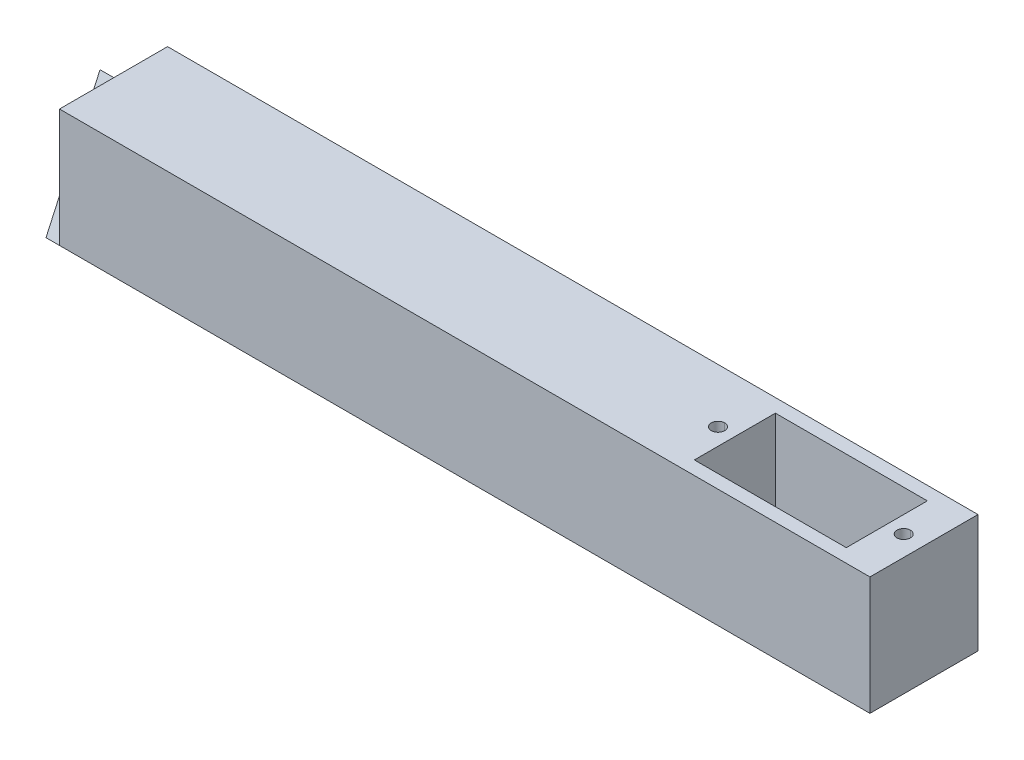
ISO-10303-21;
HEADER;
FILE_DESCRIPTION(('STEP AP214'),'2;1');
FILE_NAME('part.step','',(''),(''),'','','');
FILE_SCHEMA(('AUTOMOTIVE_DESIGN { 1 0 10303 214 1 1 1 1 }'));
ENDSEC;
DATA;
#1=APPLICATION_CONTEXT('core data for automotive mechanical design processes');
#2=APPLICATION_PROTOCOL_DEFINITION('international standard','automotive_design',2000,#1);
#3=PRODUCT_CONTEXT('',#1,'mechanical');
#4=PRODUCT('Part','Part','',(#3));
#5=PRODUCT_RELATED_PRODUCT_CATEGORY('part','',(#4));
#6=PRODUCT_DEFINITION_FORMATION('','',#4);
#7=PRODUCT_DEFINITION_CONTEXT('part definition',#1,'design');
#8=PRODUCT_DEFINITION('design','',#6,#7);
#9=PRODUCT_DEFINITION_SHAPE('','',#8);
#10=(LENGTH_UNIT() NAMED_UNIT(*) SI_UNIT(.MILLI.,.METRE.));
#11=(NAMED_UNIT(*) PLANE_ANGLE_UNIT() SI_UNIT($,.RADIAN.));
#12=(NAMED_UNIT(*) SI_UNIT($,.STERADIAN.) SOLID_ANGLE_UNIT());
#13=UNCERTAINTY_MEASURE_WITH_UNIT(LENGTH_MEASURE(1.E-05),#10,'distance_accuracy_value','');
#14=(GEOMETRIC_REPRESENTATION_CONTEXT(3) GLOBAL_UNCERTAINTY_ASSIGNED_CONTEXT((#13)) GLOBAL_UNIT_ASSIGNED_CONTEXT((#10,
#11,#12)) REPRESENTATION_CONTEXT('',''));
#15=CARTESIAN_POINT('',(0.,0.,0.));
#16=DIRECTION('',(0.,0.,1.));
#17=DIRECTION('',(1.,0.,0.));
#18=AXIS2_PLACEMENT_3D('',#15,#16,#17);
#19=CARTESIAN_POINT('',(-67.9317104586346,5.08780090483286,0.049999999999863));
#20=DIRECTION('',(-1.,0.,0.));
#21=DIRECTION('',(0.,0.,1.));
#22=AXIS2_PLACEMENT_3D('',#19,#20,#21);
#23=PLANE('',#22);
#24=CARTESIAN_POINT('',(-67.9317104586346,5.08780090483286,0.049999999999863));
#25=DIRECTION('',(-1.,0.,0.));
#26=DIRECTION('',(0.,0.,1.));
#27=AXIS2_PLACEMENT_3D('',#24,#25,#26);
#28=CIRCLE('',#27,1.);
#29=CARTESIAN_POINT('',(-67.9317104586346,5.08780090483286,1.04999999999986));
#30=VERTEX_POINT('',#29);
#31=CARTESIAN_POINT('',(-67.9317104586346,5.08780090483286,-0.950000000000137));
#32=VERTEX_POINT('',#31);
#33=EDGE_CURVE('E9',#30,#32,#28,.T.);
#34=ORIENTED_EDGE('',*,*,#33,.T.);
#35=CARTESIAN_POINT('',(-67.9317104586346,5.08780090483286,0.049999999999863));
#36=DIRECTION('',(-1.,0.,0.));
#37=DIRECTION('',(0.,0.,1.));
#38=AXIS2_PLACEMENT_3D('',#35,#36,#37);
#39=CIRCLE('',#38,1.);
#40=EDGE_CURVE('E175',#32,#30,#39,.T.);
#41=ORIENTED_EDGE('',*,*,#40,.T.);
#42=EDGE_LOOP('',(#34,#41));
#43=FACE_BOUND('',#42,.T.);
#44=ADVANCED_FACE('F14',(#43),#23,.T.);
#45=CARTESIAN_POINT('',(-67.9317104586346,5.08780090483286,0.049999999999863));
#46=DIRECTION('',(-1.,0.,0.));
#47=DIRECTION('',(0.,0.,1.));
#48=AXIS2_PLACEMENT_3D('',#45,#46,#47);
#49=CYLINDRICAL_SURFACE('',#48,1.);
#50=DIRECTION('',(-1.,0.,0.));
#51=VECTOR('',#50,1.);
#52=CARTESIAN_POINT('',(-67.9317104586346,5.08780090483286,-0.950000000000137));
#53=LINE('',#52,#51);
#54=CARTESIAN_POINT('',(-81.9317104586346,5.08780090483286,-0.950000000000137));
#55=VERTEX_POINT('',#54);
#56=EDGE_CURVE('E180',#32,#55,#53,.T.);
#57=ORIENTED_EDGE('',*,*,#56,.F.);
#58=ORIENTED_EDGE('',*,*,#33,.F.);
#59=DIRECTION('',(-1.,0.,0.));
#60=VECTOR('',#59,1.);
#61=CARTESIAN_POINT('',(-67.9317104586346,5.08780090483286,1.04999999999986));
#62=LINE('',#61,#60);
#63=CARTESIAN_POINT('',(-81.9317104586346,5.08780090483286,1.04999999999986));
#64=VERTEX_POINT('',#63);
#65=EDGE_CURVE('E189',#30,#64,#62,.T.);
#66=ORIENTED_EDGE('',*,*,#65,.T.);
#67=CARTESIAN_POINT('',(-81.9317104586346,5.08780090483286,0.049999999999863));
#68=DIRECTION('',(-1.,0.,0.));
#69=DIRECTION('',(0.,0.,1.));
#70=AXIS2_PLACEMENT_3D('',#67,#68,#69);
#71=CIRCLE('',#70,1.);
#72=EDGE_CURVE('E22',#64,#55,#71,.T.);
#73=ORIENTED_EDGE('',*,*,#72,.T.);
#74=EDGE_LOOP('',(#57,#58,#66,#73));
#75=FACE_BOUND('',#74,.T.);
#76=ADVANCED_FACE('F181',(#75),#49,.F.);
#77=CARTESIAN_POINT('',(37.0682895413656,0.,-5.21804821573824E-12));
#78=DIRECTION('',(0.,1.,0.));
#79=DIRECTION('',(0.,0.,1.));
#80=AXIS2_PLACEMENT_3D('',#77,#78,#79);
#81=CYLINDRICAL_SURFACE('',#80,0.999999999998254);
#82=DIRECTION('',(0.,1.,0.));
#83=VECTOR('',#82,1.);
#84=CARTESIAN_POINT('',(37.0682895413656,0.,-1.00000000000347));
#85=LINE('',#84,#83);
#86=CARTESIAN_POINT('',(37.0682895413656,0.,-1.00000000000347));
#87=VERTEX_POINT('',#86);
#88=CARTESIAN_POINT('',(37.0682895413656,17.5,-1.00000000000347));
#89=VERTEX_POINT('',#88);
#90=EDGE_CURVE('E224',#87,#89,#85,.T.);
#91=ORIENTED_EDGE('',*,*,#90,.F.);
#92=CARTESIAN_POINT('',(37.0682895413656,0.,-5.21804821573824E-12));
#93=DIRECTION('',(0.,1.,0.));
#94=DIRECTION('',(0.,0.,1.));
#95=AXIS2_PLACEMENT_3D('',#92,#93,#94);
#96=CIRCLE('',#95,0.999999999998254);
#97=CARTESIAN_POINT('',(37.0682895413656,0.,0.999999999993036));
#98=VERTEX_POINT('',#97);
#99=EDGE_CURVE('E331',#98,#87,#96,.T.);
#100=ORIENTED_EDGE('',*,*,#99,.F.);
#101=DIRECTION('',(0.,1.,0.));
#102=VECTOR('',#101,1.);
#103=CARTESIAN_POINT('',(37.0682895413656,0.,0.999999999993036));
#104=LINE('',#103,#102);
#105=CARTESIAN_POINT('',(37.0682895413656,17.5,0.999999999993036));
#106=VERTEX_POINT('',#105);
#107=EDGE_CURVE('E197',#98,#106,#104,.T.);
#108=ORIENTED_EDGE('',*,*,#107,.T.);
#109=CARTESIAN_POINT('',(37.0682895413656,17.5,-5.21804821573824E-12));
#110=DIRECTION('',(0.,1.,0.));
#111=DIRECTION('',(0.,0.,1.));
#112=AXIS2_PLACEMENT_3D('',#109,#110,#111);
#113=CIRCLE('',#112,0.999999999998254);
#114=EDGE_CURVE('E296',#106,#89,#113,.T.);
#115=ORIENTED_EDGE('',*,*,#114,.T.);
#116=EDGE_LOOP('',(#91,#100,#108,#115));
#117=FACE_BOUND('',#116,.T.);
#118=ADVANCED_FACE('F421',(#117),#81,.F.);
#119=CARTESIAN_POINT('',(9.56828954136565,0.,-5.21804821573824E-12));
#120=DIRECTION('',(0.,1.,0.));
#121=DIRECTION('',(0.,0.,1.));
#122=AXIS2_PLACEMENT_3D('',#119,#120,#121);
#123=CYLINDRICAL_SURFACE('',#122,0.999999999998255);
#124=DIRECTION('',(0.,1.,0.));
#125=VECTOR('',#124,1.);
#126=CARTESIAN_POINT('',(9.56828954136565,0.,-1.00000000000347));
#127=LINE('',#126,#125);
#128=CARTESIAN_POINT('',(9.56828954136565,0.,-1.00000000000347));
#129=VERTEX_POINT('',#128);
#130=CARTESIAN_POINT('',(9.56828954136565,17.5,-1.00000000000347));
#131=VERTEX_POINT('',#130);
#132=EDGE_CURVE('E238',#129,#131,#127,.T.);
#133=ORIENTED_EDGE('',*,*,#132,.F.);
#134=CARTESIAN_POINT('',(9.56828954136565,0.,-5.21804821573824E-12));
#135=DIRECTION('',(0.,1.,0.));
#136=DIRECTION('',(0.,0.,1.));
#137=AXIS2_PLACEMENT_3D('',#134,#135,#136);
#138=CIRCLE('',#137,0.999999999998255);
#139=CARTESIAN_POINT('',(9.56828954136565,0.,0.999999999993037));
#140=VERTEX_POINT('',#139);
#141=EDGE_CURVE('E334',#140,#129,#138,.T.);
#142=ORIENTED_EDGE('',*,*,#141,.F.);
#143=DIRECTION('',(0.,1.,0.));
#144=VECTOR('',#143,1.);
#145=CARTESIAN_POINT('',(9.56828954136565,0.,0.999999999993037));
#146=LINE('',#145,#144);
#147=CARTESIAN_POINT('',(9.56828954136565,17.5,0.999999999993037));
#148=VERTEX_POINT('',#147);
#149=EDGE_CURVE('E198',#140,#148,#146,.T.);
#150=ORIENTED_EDGE('',*,*,#149,.T.);
#151=CARTESIAN_POINT('',(9.56828954136565,17.5,-5.21804821573824E-12));
#152=DIRECTION('',(0.,1.,0.));
#153=DIRECTION('',(0.,0.,1.));
#154=AXIS2_PLACEMENT_3D('',#151,#152,#153);
#155=CIRCLE('',#154,0.999999999998255);
#156=EDGE_CURVE('E299',#148,#131,#155,.T.);
#157=ORIENTED_EDGE('',*,*,#156,.T.);
#158=EDGE_LOOP('',(#133,#142,#150,#157));
#159=FACE_BOUND('',#158,.T.);
#160=ADVANCED_FACE('F425',(#159),#123,.F.);
#161=CARTESIAN_POINT('',(-81.9317104586346,0.,0.));
#162=DIRECTION('',(1.,0.,0.));
#163=DIRECTION('',(0.,1.,0.));
#164=AXIS2_PLACEMENT_3D('',#161,#162,#163);
#165=PLANE('',#164);
#166=ORIENTED_EDGE('',*,*,#72,.F.);
#167=CARTESIAN_POINT('',(-81.9317104586346,5.08780090483286,0.049999999999863));
#168=DIRECTION('',(-1.,0.,0.));
#169=DIRECTION('',(0.,0.,1.));
#170=AXIS2_PLACEMENT_3D('',#167,#168,#169);
#171=CIRCLE('',#170,1.);
#172=EDGE_CURVE('E186',#55,#64,#171,.T.);
#173=ORIENTED_EDGE('',*,*,#172,.F.);
#174=EDGE_LOOP('',(#166,#173));
#175=FACE_BOUND('',#174,.T.);
#176=DIRECTION('',(0.,0.9098434748613,-0.414951625195415));
#177=VECTOR('',#176,1.);
#178=CARTESIAN_POINT('',(-81.9317104586346,0.,8.));
#179=LINE('',#178,#177);
#180=CARTESIAN_POINT('',(-81.9317104586346,0.,8.));
#181=VERTEX_POINT('',#180);
#182=CARTESIAN_POINT('',(-81.9317104586346,17.5411960260731,0.));
#183=VERTEX_POINT('',#182);
#184=EDGE_CURVE('E271',#181,#183,#179,.T.);
#185=ORIENTED_EDGE('',*,*,#184,.T.);
#186=DIRECTION('',(0.,-0.9098434748613,-0.414951625195415));
#187=VECTOR('',#186,1.);
#188=CARTESIAN_POINT('',(-81.9317104586346,17.5411960260731,0.));
#189=LINE('',#188,#187);
#190=CARTESIAN_POINT('',(-81.9317104586346,0.,-8.));
#191=VERTEX_POINT('',#190);
#192=EDGE_CURVE('E35',#183,#191,#189,.T.);
#193=ORIENTED_EDGE('',*,*,#192,.T.);
#194=DIRECTION('',(0.,0.,1.));
#195=VECTOR('',#194,1.);
#196=CARTESIAN_POINT('',(-81.9317104586346,0.,-8.));
#197=LINE('',#196,#195);
#198=EDGE_CURVE('E318',#191,#181,#197,.T.);
#199=ORIENTED_EDGE('',*,*,#198,.T.);
#200=EDGE_LOOP('',(#185,#193,#199));
#201=FACE_BOUND('',#200,.T.);
#202=ADVANCED_FACE('F392',(#175,#201),#165,.F.);
#203=CARTESIAN_POINT('',(-81.9317104586346,17.5411960260731,0.));
#204=DIRECTION('',(0.,-0.414951625195415,0.9098434748613));
#205=DIRECTION('',(-1.,0.,0.));
#206=AXIS2_PLACEMENT_3D('',#203,#204,#205);
#207=PLANE('',#206);
#208=DIRECTION('',(0.,-0.9098434748613,-0.414951625195415));
#209=VECTOR('',#208,1.);
#210=CARTESIAN_POINT('',(-79.9317104586346,17.5411960260731,0.));
#211=LINE('',#210,#209);
#212=CARTESIAN_POINT('',(-79.9317104586346,17.5411960260731,0.));
#213=VERTEX_POINT('',#212);
#214=CARTESIAN_POINT('',(-79.9317104586346,17.5,-0.0187882404424052));
#215=VERTEX_POINT('',#214);
#216=EDGE_CURVE('E207',#213,#215,#211,.T.);
#217=ORIENTED_EDGE('',*,*,#216,.T.);
#218=DIRECTION('',(0.,-0.9098434748613,-0.414951625195415));
#219=VECTOR('',#218,1.);
#220=CARTESIAN_POINT('',(-79.9317104586346,17.5411960260731,0.));
#221=LINE('',#220,#219);
#222=CARTESIAN_POINT('',(-79.9317104586346,0.,-8.));
#223=VERTEX_POINT('',#222);
#224=EDGE_CURVE('E218',#215,#223,#221,.T.);
#225=ORIENTED_EDGE('',*,*,#224,.T.);
#226=DIRECTION('',(1.,0.,0.));
#227=VECTOR('',#226,1.);
#228=CARTESIAN_POINT('',(-81.9317104586346,0.,-8.));
#229=LINE('',#228,#227);
#230=EDGE_CURVE('E322',#191,#223,#229,.T.);
#231=ORIENTED_EDGE('',*,*,#230,.F.);
#232=ORIENTED_EDGE('',*,*,#192,.F.);
#233=DIRECTION('',(1.,0.,0.));
#234=VECTOR('',#233,1.);
#235=CARTESIAN_POINT('',(-81.9317104586346,17.5411960260731,0.));
#236=LINE('',#235,#234);
#237=EDGE_CURVE('E43',#183,#213,#236,.T.);
#238=ORIENTED_EDGE('',*,*,#237,.T.);
#239=EDGE_LOOP('',(#217,#225,#231,#232,#238));
#240=FACE_BOUND('',#239,.T.);
#241=ADVANCED_FACE('F370',(#240),#207,.F.);
#242=CARTESIAN_POINT('',(-81.9317104586346,0.,8.));
#243=DIRECTION('',(0.,-0.414951625195415,-0.9098434748613));
#244=DIRECTION('',(0.,-0.9098434748613,0.414951625195415));
#245=AXIS2_PLACEMENT_3D('',#242,#243,#244);
#246=PLANE('',#245);
#247=DIRECTION('',(0.,0.9098434748613,-0.414951625195415));
#248=VECTOR('',#247,1.);
#249=CARTESIAN_POINT('',(-79.9317104586346,0.,8.));
#250=LINE('',#249,#248);
#251=CARTESIAN_POINT('',(-79.9317104586346,0.,8.));
#252=VERTEX_POINT('',#251);
#253=CARTESIAN_POINT('',(-79.9317104586346,17.5,0.0187882404424026));
#254=VERTEX_POINT('',#253);
#255=EDGE_CURVE('E201',#252,#254,#250,.T.);
#256=ORIENTED_EDGE('',*,*,#255,.T.);
#257=DIRECTION('',(0.,0.9098434748613,-0.414951625195415));
#258=VECTOR('',#257,1.);
#259=CARTESIAN_POINT('',(-79.9317104586346,0.,8.));
#260=LINE('',#259,#258);
#261=EDGE_CURVE('E204',#254,#213,#260,.T.);
#262=ORIENTED_EDGE('',*,*,#261,.T.);
#263=ORIENTED_EDGE('',*,*,#237,.F.);
#264=ORIENTED_EDGE('',*,*,#184,.F.);
#265=DIRECTION('',(1.,0.,0.));
#266=VECTOR('',#265,1.);
#267=CARTESIAN_POINT('',(-81.9317104586346,0.,8.));
#268=LINE('',#267,#266);
#269=EDGE_CURVE('E315',#181,#252,#268,.T.);
#270=ORIENTED_EDGE('',*,*,#269,.T.);
#271=EDGE_LOOP('',(#256,#262,#263,#264,#270));
#272=FACE_BOUND('',#271,.T.);
#273=ADVANCED_FACE('F394',(#272),#246,.F.);
#274=CARTESIAN_POINT('',(-79.9317104586346,0.,0.));
#275=DIRECTION('',(1.,0.,0.));
#276=DIRECTION('',(0.,1.,0.));
#277=AXIS2_PLACEMENT_3D('',#274,#275,#276);
#278=PLANE('',#277);
#279=DIRECTION('',(0.,0.,1.));
#280=VECTOR('',#279,1.);
#281=CARTESIAN_POINT('',(-79.9317104586346,17.5,8.));
#282=LINE('',#281,#280);
#283=EDGE_CURVE('E288',#215,#254,#282,.T.);
#284=ORIENTED_EDGE('',*,*,#283,.F.);
#285=ORIENTED_EDGE('',*,*,#216,.F.);
#286=ORIENTED_EDGE('',*,*,#261,.F.);
#287=EDGE_LOOP('',(#284,#285,#286));
#288=FACE_BOUND('',#287,.T.);
#289=ADVANCED_FACE('F373',(#288),#278,.T.);
#290=CARTESIAN_POINT('',(12.0682895413654,17.5,6.));
#291=DIRECTION('',(0.,0.,-1.));
#292=DIRECTION('',(0.,-1.,0.));
#293=AXIS2_PLACEMENT_3D('',#290,#291,#292);
#294=PLANE('',#293);
#295=DIRECTION('',(1.,0.,0.));
#296=VECTOR('',#295,1.);
#297=CARTESIAN_POINT('',(12.0682895413654,0.,6.));
#298=LINE('',#297,#296);
#299=CARTESIAN_POINT('',(12.0682895413654,0.,6.));
#300=VERTEX_POINT('',#299);
#301=CARTESIAN_POINT('',(34.5682895413654,0.,6.));
#302=VERTEX_POINT('',#301);
#303=EDGE_CURVE('E337',#300,#302,#298,.T.);
#304=ORIENTED_EDGE('',*,*,#303,.F.);
#305=DIRECTION('',(0.,-1.,0.));
#306=VECTOR('',#305,1.);
#307=CARTESIAN_POINT('',(12.0682895413654,17.5,6.));
#308=LINE('',#307,#306);
#309=CARTESIAN_POINT('',(12.0682895413654,17.5,6.));
#310=VERTEX_POINT('',#309);
#311=EDGE_CURVE('E363',#310,#300,#308,.T.);
#312=ORIENTED_EDGE('',*,*,#311,.F.);
#313=DIRECTION('',(1.,0.,0.));
#314=VECTOR('',#313,1.);
#315=CARTESIAN_POINT('',(12.0682895413654,17.5,6.));
#316=LINE('',#315,#314);
#317=CARTESIAN_POINT('',(34.5682895413654,17.5,6.));
#318=VERTEX_POINT('',#317);
#319=EDGE_CURVE('E208',#310,#318,#316,.T.);
#320=ORIENTED_EDGE('',*,*,#319,.T.);
#321=DIRECTION('',(0.,-1.,0.));
#322=VECTOR('',#321,1.);
#323=CARTESIAN_POINT('',(34.5682895413654,17.5,6.));
#324=LINE('',#323,#322);
#325=EDGE_CURVE('E249',#318,#302,#324,.T.);
#326=ORIENTED_EDGE('',*,*,#325,.T.);
#327=EDGE_LOOP('',(#304,#312,#320,#326));
#328=FACE_BOUND('',#327,.T.);
#329=ADVANCED_FACE('F443',(#328),#294,.T.);
#330=CARTESIAN_POINT('',(12.0682895413654,17.5,6.));
#331=DIRECTION('',(1.,0.,0.));
#332=DIRECTION('',(0.,0.,-1.));
#333=AXIS2_PLACEMENT_3D('',#330,#331,#332);
#334=PLANE('',#333);
#335=DIRECTION('',(0.,0.,1.));
#336=VECTOR('',#335,1.);
#337=CARTESIAN_POINT('',(12.0682895413654,0.,6.));
#338=LINE('',#337,#336);
#339=CARTESIAN_POINT('',(12.0682895413654,0.,-6.));
#340=VERTEX_POINT('',#339);
#341=EDGE_CURVE('E349',#340,#300,#338,.T.);
#342=ORIENTED_EDGE('',*,*,#341,.F.);
#343=DIRECTION('',(0.,-1.,0.));
#344=VECTOR('',#343,1.);
#345=CARTESIAN_POINT('',(12.0682895413654,17.5,-6.));
#346=LINE('',#345,#344);
#347=CARTESIAN_POINT('',(12.0682895413654,17.5,-6.));
#348=VERTEX_POINT('',#347);
#349=EDGE_CURVE('E360',#348,#340,#346,.T.);
#350=ORIENTED_EDGE('',*,*,#349,.F.);
#351=DIRECTION('',(0.,0.,1.));
#352=VECTOR('',#351,1.);
#353=CARTESIAN_POINT('',(12.0682895413654,17.5,6.));
#354=LINE('',#353,#352);
#355=EDGE_CURVE('E212',#348,#310,#354,.T.);
#356=ORIENTED_EDGE('',*,*,#355,.T.);
#357=ORIENTED_EDGE('',*,*,#311,.T.);
#358=EDGE_LOOP('',(#342,#350,#356,#357));
#359=FACE_BOUND('',#358,.T.);
#360=ADVANCED_FACE('F440',(#359),#334,.T.);
#361=CARTESIAN_POINT('',(12.0682895413654,17.5,-6.));
#362=DIRECTION('',(0.,0.,1.));
#363=DIRECTION('',(1.,0.,0.));
#364=AXIS2_PLACEMENT_3D('',#361,#362,#363);
#365=PLANE('',#364);
#366=DIRECTION('',(-1.,0.,0.));
#367=VECTOR('',#366,1.);
#368=CARTESIAN_POINT('',(12.0682895413654,0.,-6.));
#369=LINE('',#368,#367);
#370=CARTESIAN_POINT('',(34.5682895413654,0.,-6.));
#371=VERTEX_POINT('',#370);
#372=EDGE_CURVE('E345',#371,#340,#369,.T.);
#373=ORIENTED_EDGE('',*,*,#372,.F.);
#374=DIRECTION('',(0.,-1.,0.));
#375=VECTOR('',#374,1.);
#376=CARTESIAN_POINT('',(34.5682895413654,17.5,-6.));
#377=LINE('',#376,#375);
#378=CARTESIAN_POINT('',(34.5682895413654,17.5,-6.));
#379=VERTEX_POINT('',#378);
#380=EDGE_CURVE('E357',#379,#371,#377,.T.);
#381=ORIENTED_EDGE('',*,*,#380,.F.);
#382=DIRECTION('',(-1.,0.,0.));
#383=VECTOR('',#382,1.);
#384=CARTESIAN_POINT('',(12.0682895413654,17.5,-6.));
#385=LINE('',#384,#383);
#386=EDGE_CURVE('E229',#379,#348,#385,.T.);
#387=ORIENTED_EDGE('',*,*,#386,.T.);
#388=ORIENTED_EDGE('',*,*,#349,.T.);
#389=EDGE_LOOP('',(#373,#381,#387,#388));
#390=FACE_BOUND('',#389,.T.);
#391=ADVANCED_FACE('F413',(#390),#365,.T.);
#392=CARTESIAN_POINT('',(34.5682895413654,17.5,6.));
#393=DIRECTION('',(-1.,0.,0.));
#394=DIRECTION('',(0.,0.,1.));
#395=AXIS2_PLACEMENT_3D('',#392,#393,#394);
#396=PLANE('',#395);
#397=DIRECTION('',(0.,0.,-1.));
#398=VECTOR('',#397,1.);
#399=CARTESIAN_POINT('',(34.5682895413654,0.,6.));
#400=LINE('',#399,#398);
#401=EDGE_CURVE('E341',#302,#371,#400,.T.);
#402=ORIENTED_EDGE('',*,*,#401,.F.);
#403=ORIENTED_EDGE('',*,*,#325,.F.);
#404=DIRECTION('',(0.,0.,-1.));
#405=VECTOR('',#404,1.);
#406=CARTESIAN_POINT('',(34.5682895413654,17.5,6.));
#407=LINE('',#406,#405);
#408=EDGE_CURVE('E213',#318,#379,#407,.T.);
#409=ORIENTED_EDGE('',*,*,#408,.T.);
#410=ORIENTED_EDGE('',*,*,#380,.T.);
#411=EDGE_LOOP('',(#402,#403,#409,#410));
#412=FACE_BOUND('',#411,.T.);
#413=ADVANCED_FACE('F405',(#412),#396,.T.);
#414=CARTESIAN_POINT('',(-79.9317104586346,17.5,8.));
#415=DIRECTION('',(0.,0.,-1.));
#416=DIRECTION('',(0.,-1.,0.));
#417=AXIS2_PLACEMENT_3D('',#414,#415,#416);
#418=PLANE('',#417);
#419=DIRECTION('',(1.,0.,0.));
#420=VECTOR('',#419,1.);
#421=CARTESIAN_POINT('',(-79.9317104586346,0.,8.));
#422=LINE('',#421,#420);
#423=CARTESIAN_POINT('',(40.0682895413654,0.,8.));
#424=VERTEX_POINT('',#423);
#425=EDGE_CURVE('E311',#252,#424,#422,.T.);
#426=ORIENTED_EDGE('',*,*,#425,.T.);
#427=DIRECTION('',(0.,-1.,0.));
#428=VECTOR('',#427,1.);
#429=CARTESIAN_POINT('',(40.0682895413654,17.5,8.));
#430=LINE('',#429,#428);
#431=CARTESIAN_POINT('',(40.0682895413654,17.5,8.));
#432=VERTEX_POINT('',#431);
#433=EDGE_CURVE('E246',#432,#424,#430,.T.);
#434=ORIENTED_EDGE('',*,*,#433,.F.);
#435=DIRECTION('',(1.,0.,0.));
#436=VECTOR('',#435,1.);
#437=CARTESIAN_POINT('',(-79.9317104586346,17.5,8.));
#438=LINE('',#437,#436);
#439=CARTESIAN_POINT('',(-79.9317104586346,17.5,8.));
#440=VERTEX_POINT('',#439);
#441=EDGE_CURVE('E292',#440,#432,#438,.T.);
#442=ORIENTED_EDGE('',*,*,#441,.F.);
#443=DIRECTION('',(0.,-1.,0.));
#444=VECTOR('',#443,1.);
#445=CARTESIAN_POINT('',(-79.9317104586346,17.5,8.));
#446=LINE('',#445,#444);
#447=EDGE_CURVE('E219',#440,#252,#446,.T.);
#448=ORIENTED_EDGE('',*,*,#447,.T.);
#449=EDGE_LOOP('',(#426,#434,#442,#448));
#450=FACE_BOUND('',#449,.T.);
#451=ADVANCED_FACE('F403',(#450),#418,.F.);
#452=CARTESIAN_POINT('',(-79.9317104586346,17.5,-8.));
#453=DIRECTION('',(0.,0.,1.));
#454=DIRECTION('',(1.,0.,0.));
#455=AXIS2_PLACEMENT_3D('',#452,#453,#454);
#456=PLANE('',#455);
#457=DIRECTION('',(-1.,0.,0.));
#458=VECTOR('',#457,1.);
#459=CARTESIAN_POINT('',(-79.9317104586346,0.,-8.));
#460=LINE('',#459,#458);
#461=CARTESIAN_POINT('',(40.0682895413654,0.,-8.));
#462=VERTEX_POINT('',#461);
#463=EDGE_CURVE('E326',#462,#223,#460,.T.);
#464=ORIENTED_EDGE('',*,*,#463,.T.);
#465=DIRECTION('',(0.,-1.,0.));
#466=VECTOR('',#465,1.);
#467=CARTESIAN_POINT('',(-79.9317104586346,17.5,-8.));
#468=LINE('',#467,#466);
#469=CARTESIAN_POINT('',(-79.9317104586346,17.5,-8.));
#470=VERTEX_POINT('',#469);
#471=EDGE_CURVE('E277',#470,#223,#468,.T.);
#472=ORIENTED_EDGE('',*,*,#471,.F.);
#473=DIRECTION('',(-1.,0.,0.));
#474=VECTOR('',#473,1.);
#475=CARTESIAN_POINT('',(-79.9317104586346,17.5,-8.));
#476=LINE('',#475,#474);
#477=CARTESIAN_POINT('',(40.0682895413654,17.5,-8.));
#478=VERTEX_POINT('',#477);
#479=EDGE_CURVE('E285',#478,#470,#476,.T.);
#480=ORIENTED_EDGE('',*,*,#479,.F.);
#481=DIRECTION('',(0.,-1.,0.));
#482=VECTOR('',#481,1.);
#483=CARTESIAN_POINT('',(40.0682895413654,17.5,-8.));
#484=LINE('',#483,#482);
#485=EDGE_CURVE('E250',#478,#462,#484,.T.);
#486=ORIENTED_EDGE('',*,*,#485,.T.);
#487=EDGE_LOOP('',(#464,#472,#480,#486));
#488=FACE_BOUND('',#487,.T.);
#489=ADVANCED_FACE('F383',(#488),#456,.F.);
#490=CARTESIAN_POINT('',(40.0682895413654,17.5,8.));
#491=DIRECTION('',(-1.,0.,0.));
#492=DIRECTION('',(0.,0.,1.));
#493=AXIS2_PLACEMENT_3D('',#490,#491,#492);
#494=PLANE('',#493);
#495=DIRECTION('',(0.,0.,-1.));
#496=VECTOR('',#495,1.);
#497=CARTESIAN_POINT('',(40.0682895413654,0.,8.));
#498=LINE('',#497,#496);
#499=EDGE_CURVE('E233',#424,#462,#498,.T.);
#500=ORIENTED_EDGE('',*,*,#499,.T.);
#501=ORIENTED_EDGE('',*,*,#485,.F.);
#502=DIRECTION('',(0.,0.,-1.));
#503=VECTOR('',#502,1.);
#504=CARTESIAN_POINT('',(40.0682895413654,17.5,8.));
#505=LINE('',#504,#503);
#506=EDGE_CURVE('E281',#432,#478,#505,.T.);
#507=ORIENTED_EDGE('',*,*,#506,.F.);
#508=ORIENTED_EDGE('',*,*,#433,.T.);
#509=EDGE_LOOP('',(#500,#501,#507,#508));
#510=FACE_BOUND('',#509,.T.);
#511=ADVANCED_FACE('F402',(#510),#494,.F.);
#512=CARTESIAN_POINT('',(0.,0.,0.));
#513=DIRECTION('',(0.,-1.,0.));
#514=DIRECTION('',(0.,0.,-1.));
#515=AXIS2_PLACEMENT_3D('',#512,#513,#514);
#516=PLANE('',#515);
#517=ORIENTED_EDGE('',*,*,#303,.T.);
#518=ORIENTED_EDGE('',*,*,#401,.T.);
#519=ORIENTED_EDGE('',*,*,#372,.T.);
#520=ORIENTED_EDGE('',*,*,#341,.T.);
#521=EDGE_LOOP('',(#517,#518,#519,#520));
#522=FACE_BOUND('',#521,.T.);
#523=ORIENTED_EDGE('',*,*,#141,.T.);
#524=CARTESIAN_POINT('',(9.56828954136565,0.,-5.21804821573824E-12));
#525=DIRECTION('',(0.,1.,0.));
#526=DIRECTION('',(0.,0.,1.));
#527=AXIS2_PLACEMENT_3D('',#524,#525,#526);
#528=CIRCLE('',#527,0.999999999998255);
#529=EDGE_CURVE('E242',#129,#140,#528,.T.);
#530=ORIENTED_EDGE('',*,*,#529,.T.);
#531=EDGE_LOOP('',(#523,#530));
#532=FACE_BOUND('',#531,.T.);
#533=ORIENTED_EDGE('',*,*,#99,.T.);
#534=CARTESIAN_POINT('',(37.0682895413656,0.,-5.21804821573824E-12));
#535=DIRECTION('',(0.,1.,0.));
#536=DIRECTION('',(0.,0.,1.));
#537=AXIS2_PLACEMENT_3D('',#534,#535,#536);
#538=CIRCLE('',#537,0.999999999998254);
#539=EDGE_CURVE('E225',#87,#98,#538,.T.);
#540=ORIENTED_EDGE('',*,*,#539,.T.);
#541=EDGE_LOOP('',(#533,#540));
#542=FACE_BOUND('',#541,.T.);
#543=ORIENTED_EDGE('',*,*,#499,.F.);
#544=ORIENTED_EDGE('',*,*,#425,.F.);
#545=ORIENTED_EDGE('',*,*,#269,.F.);
#546=ORIENTED_EDGE('',*,*,#198,.F.);
#547=ORIENTED_EDGE('',*,*,#230,.T.);
#548=ORIENTED_EDGE('',*,*,#463,.F.);
#549=EDGE_LOOP('',(#543,#544,#545,#546,#547,#548));
#550=FACE_BOUND('',#549,.T.);
#551=ADVANCED_FACE('F388',(#522,#532,#542,#550),#516,.T.);
#552=CARTESIAN_POINT('',(0.,17.5,0.));
#553=DIRECTION('',(0.,-1.,0.));
#554=DIRECTION('',(0.,0.,-1.));
#555=AXIS2_PLACEMENT_3D('',#552,#553,#554);
#556=PLANE('',#555);
#557=ORIENTED_EDGE('',*,*,#408,.F.);
#558=ORIENTED_EDGE('',*,*,#319,.F.);
#559=ORIENTED_EDGE('',*,*,#355,.F.);
#560=ORIENTED_EDGE('',*,*,#386,.F.);
#561=EDGE_LOOP('',(#557,#558,#559,#560));
#562=FACE_BOUND('',#561,.T.);
#563=ORIENTED_EDGE('',*,*,#156,.F.);
#564=CARTESIAN_POINT('',(9.56828954136565,17.5,-5.21804821573824E-12));
#565=DIRECTION('',(0.,1.,0.));
#566=DIRECTION('',(0.,0.,1.));
#567=AXIS2_PLACEMENT_3D('',#564,#565,#566);
#568=CIRCLE('',#567,0.999999999998255);
#569=EDGE_CURVE('E202',#131,#148,#568,.T.);
#570=ORIENTED_EDGE('',*,*,#569,.F.);
#571=EDGE_LOOP('',(#563,#570));
#572=FACE_BOUND('',#571,.T.);
#573=ORIENTED_EDGE('',*,*,#114,.F.);
#574=CARTESIAN_POINT('',(37.0682895413656,17.5,-5.21804821573824E-12));
#575=DIRECTION('',(0.,1.,0.));
#576=DIRECTION('',(0.,0.,1.));
#577=AXIS2_PLACEMENT_3D('',#574,#575,#576);
#578=CIRCLE('',#577,0.999999999998254);
#579=EDGE_CURVE('E220',#89,#106,#578,.T.);
#580=ORIENTED_EDGE('',*,*,#579,.F.);
#581=EDGE_LOOP('',(#573,#580));
#582=FACE_BOUND('',#581,.T.);
#583=ORIENTED_EDGE('',*,*,#506,.T.);
#584=ORIENTED_EDGE('',*,*,#479,.T.);
#585=DIRECTION('',(0.,0.,1.));
#586=VECTOR('',#585,1.);
#587=CARTESIAN_POINT('',(-79.9317104586346,17.5,8.));
#588=LINE('',#587,#586);
#589=EDGE_CURVE('E266',#470,#215,#588,.T.);
#590=ORIENTED_EDGE('',*,*,#589,.T.);
#591=ORIENTED_EDGE('',*,*,#283,.T.);
#592=DIRECTION('',(0.,0.,1.));
#593=VECTOR('',#592,1.);
#594=CARTESIAN_POINT('',(-79.9317104586346,17.5,8.));
#595=LINE('',#594,#593);
#596=EDGE_CURVE('E214',#254,#440,#595,.T.);
#597=ORIENTED_EDGE('',*,*,#596,.T.);
#598=ORIENTED_EDGE('',*,*,#441,.T.);
#599=EDGE_LOOP('',(#583,#584,#590,#591,#597,#598));
#600=FACE_BOUND('',#599,.T.);
#601=ADVANCED_FACE('F377',(#562,#572,#582,#600),#556,.F.);
#602=CARTESIAN_POINT('',(-79.9317104586346,17.5,8.));
#603=DIRECTION('',(1.,0.,0.));
#604=DIRECTION('',(0.,1.,0.));
#605=AXIS2_PLACEMENT_3D('',#602,#603,#604);
#606=PLANE('',#605);
#607=ORIENTED_EDGE('',*,*,#224,.F.);
#608=ORIENTED_EDGE('',*,*,#589,.F.);
#609=ORIENTED_EDGE('',*,*,#471,.T.);
#610=EDGE_LOOP('',(#607,#608,#609));
#611=FACE_BOUND('',#610,.T.);
#612=ADVANCED_FACE('F381',(#611),#606,.F.);
#613=CARTESIAN_POINT('',(-79.9317104586346,17.5,8.));
#614=DIRECTION('',(1.,0.,0.));
#615=DIRECTION('',(0.,1.,0.));
#616=AXIS2_PLACEMENT_3D('',#613,#614,#615);
#617=PLANE('',#616);
#618=ORIENTED_EDGE('',*,*,#255,.F.);
#619=ORIENTED_EDGE('',*,*,#447,.F.);
#620=ORIENTED_EDGE('',*,*,#596,.F.);
#621=EDGE_LOOP('',(#618,#619,#620));
#622=FACE_BOUND('',#621,.T.);
#623=ADVANCED_FACE('F398',(#622),#617,.F.);
#624=CARTESIAN_POINT('',(9.56828954136565,0.,-5.21804821573824E-12));
#625=DIRECTION('',(0.,1.,0.));
#626=DIRECTION('',(0.,0.,1.));
#627=AXIS2_PLACEMENT_3D('',#624,#625,#626);
#628=CYLINDRICAL_SURFACE('',#627,0.999999999998255);
#629=ORIENTED_EDGE('',*,*,#529,.F.);
#630=ORIENTED_EDGE('',*,*,#132,.T.);
#631=ORIENTED_EDGE('',*,*,#569,.T.);
#632=ORIENTED_EDGE('',*,*,#149,.F.);
#633=EDGE_LOOP('',(#629,#630,#631,#632));
#634=FACE_BOUND('',#633,.T.);
#635=ADVANCED_FACE('F715',(#634),#628,.F.);
#636=CARTESIAN_POINT('',(37.0682895413656,0.,-5.21804821573824E-12));
#637=DIRECTION('',(0.,1.,0.));
#638=DIRECTION('',(0.,0.,1.));
#639=AXIS2_PLACEMENT_3D('',#636,#637,#638);
#640=CYLINDRICAL_SURFACE('',#639,0.999999999998254);
#641=ORIENTED_EDGE('',*,*,#539,.F.);
#642=ORIENTED_EDGE('',*,*,#90,.T.);
#643=ORIENTED_EDGE('',*,*,#579,.T.);
#644=ORIENTED_EDGE('',*,*,#107,.F.);
#645=EDGE_LOOP('',(#641,#642,#643,#644));
#646=FACE_BOUND('',#645,.T.);
#647=ADVANCED_FACE('F476',(#646),#640,.F.);
#648=CARTESIAN_POINT('',(-67.9317104586346,5.08780090483286,0.049999999999863));
#649=DIRECTION('',(-1.,0.,0.));
#650=DIRECTION('',(0.,0.,1.));
#651=AXIS2_PLACEMENT_3D('',#648,#649,#650);
#652=CYLINDRICAL_SURFACE('',#651,1.);
#653=ORIENTED_EDGE('',*,*,#40,.F.);
#654=ORIENTED_EDGE('',*,*,#56,.T.);
#655=ORIENTED_EDGE('',*,*,#172,.T.);
#656=ORIENTED_EDGE('',*,*,#65,.F.);
#657=EDGE_LOOP('',(#653,#654,#655,#656));
#658=FACE_BOUND('',#657,.T.);
#659=ADVANCED_FACE('F188',(#658),#652,.F.);
#660=CLOSED_SHELL('',(#44,#76,#118,#160,#202,#241,#273,#289,#329,#360,#391,#413,#451,#489,#511,
#551,#601,#612,#623,#635,#647,#659));
#661=MANIFOLD_SOLID_BREP('B1',#660);
#662=ADVANCED_BREP_SHAPE_REPRESENTATION('',(#18,#661),#14);
#663=SHAPE_DEFINITION_REPRESENTATION(#9,#662);
ENDSEC;
END-ISO-10303-21;
